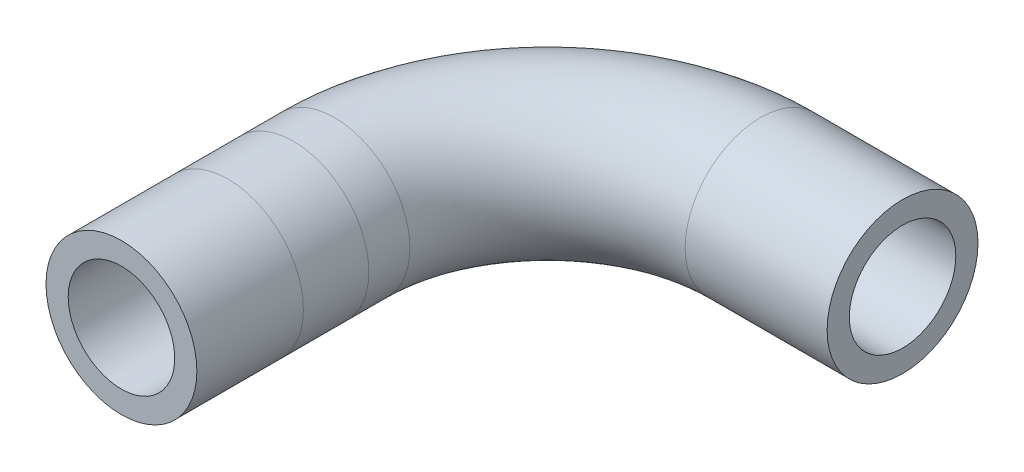
ISO-10303-21;
HEADER;
FILE_DESCRIPTION(('STEP AP214'),'2;1');
FILE_NAME('part.step','',(''),(''),'','','');
FILE_SCHEMA(('AUTOMOTIVE_DESIGN { 1 0 10303 214 1 1 1 1 }'));
ENDSEC;
DATA;
#1=APPLICATION_CONTEXT('core data for automotive mechanical design processes');
#2=APPLICATION_PROTOCOL_DEFINITION('international standard','automotive_design',2000,#1);
#3=PRODUCT_CONTEXT('',#1,'mechanical');
#4=PRODUCT('Part','Part','',(#3));
#5=PRODUCT_RELATED_PRODUCT_CATEGORY('part','',(#4));
#6=PRODUCT_DEFINITION_FORMATION('','',#4);
#7=PRODUCT_DEFINITION_CONTEXT('part definition',#1,'design');
#8=PRODUCT_DEFINITION('design','',#6,#7);
#9=PRODUCT_DEFINITION_SHAPE('','',#8);
#10=(LENGTH_UNIT() NAMED_UNIT(*) SI_UNIT(.MILLI.,.METRE.));
#11=(NAMED_UNIT(*) PLANE_ANGLE_UNIT() SI_UNIT($,.RADIAN.));
#12=(NAMED_UNIT(*) SI_UNIT($,.STERADIAN.) SOLID_ANGLE_UNIT());
#13=UNCERTAINTY_MEASURE_WITH_UNIT(LENGTH_MEASURE(1.E-05),#10,'distance_accuracy_value','');
#14=(GEOMETRIC_REPRESENTATION_CONTEXT(3) GLOBAL_UNCERTAINTY_ASSIGNED_CONTEXT((#13)) GLOBAL_UNIT_ASSIGNED_CONTEXT((#10,
#11,#12)) REPRESENTATION_CONTEXT('',''));
#15=CARTESIAN_POINT('',(0.,0.,0.));
#16=DIRECTION('',(0.,0.,1.));
#17=DIRECTION('',(1.,0.,0.));
#18=AXIS2_PLACEMENT_3D('',#15,#16,#17);
#19=CARTESIAN_POINT('',(-39.4506366392634,4.41546785233906E-13,30.7500469580002));
#20=DIRECTION('',(0.,0.,-1.));
#21=DIRECTION('',(-1.,0.,0.));
#22=AXIS2_PLACEMENT_3D('',#19,#20,#21);
#23=PLANE('',#22);
#24=CARTESIAN_POINT('',(-39.4506366392634,4.41546785233906E-13,30.7500469580002));
#25=DIRECTION('',(0.,0.,-1.));
#26=DIRECTION('',(-1.,0.,0.));
#27=AXIS2_PLACEMENT_3D('',#24,#25,#26);
#28=CIRCLE('',#27,9.525);
#29=CARTESIAN_POINT('',(-48.9756366392634,4.41546785233906E-13,30.7500469580002));
#30=VERTEX_POINT('',#29);
#31=EDGE_CURVE('E85',#30,#30,#28,.F.);
#32=ORIENTED_EDGE('',*,*,#31,.F.);
#33=EDGE_LOOP('',(#32));
#34=FACE_BOUND('',#33,.T.);
#35=CARTESIAN_POINT('',(-39.4506366392634,4.41546785233906E-13,30.7500469580002));
#36=DIRECTION('',(0.,0.,-1.));
#37=DIRECTION('',(-1.,0.,0.));
#38=AXIS2_PLACEMENT_3D('',#35,#36,#37);
#39=CIRCLE('',#38,13.49375);
#40=CARTESIAN_POINT('',(-52.9443866392634,4.41546785233906E-13,30.7500469580002));
#41=VERTEX_POINT('',#40);
#42=EDGE_CURVE('E82',#41,#41,#39,.T.);
#43=ORIENTED_EDGE('',*,*,#42,.F.);
#44=EDGE_LOOP('',(#43));
#45=FACE_BOUND('',#44,.T.);
#46=ADVANCED_FACE('F60',(#34,#45),#23,.F.);
#47=CARTESIAN_POINT('',(24.0493633607368,4.39991483798989E-13,-45.4499530419998));
#48=DIRECTION('',(1.,0.,0.));
#49=DIRECTION('',(0.,0.,-1.));
#50=AXIS2_PLACEMENT_3D('',#47,#48,#49);
#51=PLANE('',#50);
#52=CARTESIAN_POINT('',(24.0493633607368,4.41157959875177E-13,-45.4499530419998));
#53=DIRECTION('',(1.,0.,0.));
#54=DIRECTION('',(0.,0.,-1.));
#55=AXIS2_PLACEMENT_3D('',#52,#53,#54);
#56=CIRCLE('',#55,9.525);
#57=CARTESIAN_POINT('',(24.0493633607367,4.41157959875177E-13,-54.9749530419998));
#58=VERTEX_POINT('',#57);
#59=EDGE_CURVE('E86',#58,#58,#56,.F.);
#60=ORIENTED_EDGE('',*,*,#59,.T.);
#61=EDGE_LOOP('',(#60));
#62=FACE_BOUND('',#61,.T.);
#63=CARTESIAN_POINT('',(24.0493633607368,4.39991483798989E-13,-45.4499530419998));
#64=DIRECTION('',(1.,0.,0.));
#65=DIRECTION('',(0.,0.,-1.));
#66=AXIS2_PLACEMENT_3D('',#63,#64,#65);
#67=CIRCLE('',#66,13.49375);
#68=CARTESIAN_POINT('',(24.0493633607367,4.39991483798989E-13,-58.9437030419998));
#69=VERTEX_POINT('',#68);
#70=EDGE_CURVE('E11',#69,#69,#67,.T.);
#71=ORIENTED_EDGE('',*,*,#70,.T.);
#72=EDGE_LOOP('',(#71));
#73=FACE_BOUND('',#72,.T.);
#74=ADVANCED_FACE('F109',(#62,#73),#51,.T.);
#75=CARTESIAN_POINT('',(-39.4506366392634,4.41546785233906E-13,30.7500469580002));
#76=DIRECTION('',(0.,0.,-1.));
#77=DIRECTION('',(-1.,0.,0.));
#78=AXIS2_PLACEMENT_3D('',#75,#76,#77);
#79=CYLINDRICAL_SURFACE('',#78,13.49375);
#80=CARTESIAN_POINT('',(-39.4506366392634,4.32029398355307E-13,11.7000469580002));
#81=DIRECTION('',(0.,0.,-1.));
#82=DIRECTION('',(-1.,0.,0.));
#83=AXIS2_PLACEMENT_3D('',#80,#81,#82);
#84=CIRCLE('',#83,13.49375);
#85=CARTESIAN_POINT('',(-52.9443866392634,4.32029398355307E-13,11.7000469580002));
#86=VERTEX_POINT('',#85);
#87=EDGE_CURVE('E79',#86,#86,#84,.T.);
#88=ORIENTED_EDGE('',*,*,#87,.F.);
#89=EDGE_LOOP('',(#88));
#90=FACE_BOUND('',#89,.T.);
#91=ORIENTED_EDGE('',*,*,#42,.T.);
#92=EDGE_LOOP('',(#91));
#93=FACE_BOUND('',#92,.T.);
#94=ADVANCED_FACE('F113',(#90,#93),#79,.T.);
#95=CARTESIAN_POINT('',(-39.4506366392633,4.72405715726183E-13,11.7000469580003));
#96=DIRECTION('',(0.,0.,-1.));
#97=DIRECTION('',(-1.,0.,0.));
#98=AXIS2_PLACEMENT_3D('',#95,#96,#97);
#99=CYLINDRICAL_SURFACE('',#98,13.49375);
#100=CARTESIAN_POINT('',(-39.4506366392633,4.81923102604782E-13,-3.04270497686332E-12));
#101=DIRECTION('',(0.,0.,-1.));
#102=DIRECTION('',(-1.,0.,0.));
#103=AXIS2_PLACEMENT_3D('',#100,#101,#102);
#104=CIRCLE('',#103,13.49375);
#105=CARTESIAN_POINT('',(-52.9443866392633,4.81923102604782E-13,-3.02718376681511E-12));
#106=VERTEX_POINT('',#105);
#107=EDGE_CURVE('E74',#106,#106,#104,.T.);
#108=ORIENTED_EDGE('',*,*,#107,.F.);
#109=EDGE_LOOP('',(#108));
#110=FACE_BOUND('',#109,.T.);
#111=ORIENTED_EDGE('',*,*,#87,.T.);
#112=EDGE_LOOP('',(#111));
#113=FACE_BOUND('',#112,.T.);
#114=ADVANCED_FACE('F115',(#110,#113),#99,.T.);
#115=CARTESIAN_POINT('',(-39.4506366392634,4.56909519797391E-13,-3.08780778723872E-12));
#116=DIRECTION('',(0.,0.,-1.));
#117=DIRECTION('',(-1.,0.,0.));
#118=AXIS2_PLACEMENT_3D('',#115,#116,#117);
#119=CYLINDRICAL_SURFACE('',#118,13.49375);
#120=CARTESIAN_POINT('',(-39.4506366392634,4.56909519797391E-13,-7.34995304199977));
#121=DIRECTION('',(0.,0.,-1.));
#122=DIRECTION('',(-1.,0.,0.));
#123=AXIS2_PLACEMENT_3D('',#120,#121,#122);
#124=CIRCLE('',#123,13.49375);
#125=CARTESIAN_POINT('',(-52.9443866392634,4.56634101834958E-13,-7.34995304199975));
#126=VERTEX_POINT('',#125);
#127=EDGE_CURVE('E70',#126,#126,#124,.T.);
#128=ORIENTED_EDGE('',*,*,#127,.F.);
#129=EDGE_LOOP('',(#128));
#130=FACE_BOUND('',#129,.T.);
#131=ORIENTED_EDGE('',*,*,#107,.T.);
#132=EDGE_LOOP('',(#131));
#133=FACE_BOUND('',#132,.T.);
#134=ADVANCED_FACE('F122',(#130,#133),#119,.T.);
#135=CARTESIAN_POINT('',(-1.35063663926338,4.5768717051485E-13,-7.34995304199981));
#136=DIRECTION('',(0.,-1.,0.));
#137=DIRECTION('',(0.,0.,-1.));
#138=AXIS2_PLACEMENT_3D('',#135,#136,#137);
#139=TOROIDAL_SURFACE('',#138,38.1,13.49375);
#140=CARTESIAN_POINT('',(-1.35063663926338,4.42324435951365E-13,-45.4499530419998));
#141=DIRECTION('',(1.,0.,0.));
#142=DIRECTION('',(0.,0.,-1.));
#143=AXIS2_PLACEMENT_3D('',#140,#141,#142);
#144=CIRCLE('',#143,13.49375);
#145=CARTESIAN_POINT('',(-1.35063663926338,4.36883467460131E-13,-58.9437030419998));
#146=VERTEX_POINT('',#145);
#147=EDGE_CURVE('E66',#146,#146,#144,.T.);
#148=CARTESIAN_POINT('',(-1.35063663926338,4.5768717051485E-13,-7.34995304199981));
#149=DIRECTION('',(0.,-1.,0.));
#150=DIRECTION('',(0.,0.,-1.));
#151=AXIS2_PLACEMENT_3D('',#148,#149,#150);
#152=CIRCLE('',#151,51.59375);
#153=EDGE_CURVE('',#126,#146,#152,.T.);
#154=ORIENTED_EDGE('',*,*,#127,.T.);
#155=ORIENTED_EDGE('',*,*,#147,.F.);
#156=ORIENTED_EDGE('',*,*,#153,.T.);
#157=ORIENTED_EDGE('',*,*,#153,.F.);
#158=EDGE_LOOP('',(#154,#156,#155,#157));
#159=FACE_BOUND('',#158,.T.);
#160=ADVANCED_FACE('F130',(#159),#139,.T.);
#161=CARTESIAN_POINT('',(-1.35063663926325,4.39991483798989E-13,-45.4499530419998));
#162=DIRECTION('',(1.,0.,0.));
#163=DIRECTION('',(0.,0.,-1.));
#164=AXIS2_PLACEMENT_3D('',#161,#162,#163);
#165=CYLINDRICAL_SURFACE('',#164,13.49375);
#166=ORIENTED_EDGE('',*,*,#70,.F.);
#167=EDGE_LOOP('',(#166));
#168=FACE_BOUND('',#167,.T.);
#169=ORIENTED_EDGE('',*,*,#147,.T.);
#170=EDGE_LOOP('',(#169));
#171=FACE_BOUND('',#170,.T.);
#172=ADVANCED_FACE('F128',(#168,#171),#165,.T.);
#173=CARTESIAN_POINT('',(-1.35063663926331,4.41157959875177E-13,-45.4499530419998));
#174=DIRECTION('',(1.,0.,0.));
#175=DIRECTION('',(0.,0.,-1.));
#176=AXIS2_PLACEMENT_3D('',#173,#174,#175);
#177=CYLINDRICAL_SURFACE('',#176,9.525);
#178=CARTESIAN_POINT('',(-1.35063663926338,4.42324435951365E-13,-45.4499530419998));
#179=DIRECTION('',(1.,0.,0.));
#180=DIRECTION('',(0.,0.,-1.));
#181=AXIS2_PLACEMENT_3D('',#178,#179,#180);
#182=CIRCLE('',#181,9.525);
#183=CARTESIAN_POINT('',(-1.35063663926338,4.38483752310494E-13,-54.9749530419998));
#184=VERTEX_POINT('',#183);
#185=EDGE_CURVE('E90',#184,#184,#182,.T.);
#186=ORIENTED_EDGE('',*,*,#185,.F.);
#187=EDGE_LOOP('',(#186));
#188=FACE_BOUND('',#187,.T.);
#189=ORIENTED_EDGE('',*,*,#59,.F.);
#190=EDGE_LOOP('',(#189));
#191=FACE_BOUND('',#190,.T.);
#192=ADVANCED_FACE('F110',(#188,#191),#177,.F.);
#193=CARTESIAN_POINT('',(-39.4506366392634,4.43545186678232E-13,34.7500469580002));
#194=DIRECTION('',(0.,0.,-1.));
#195=DIRECTION('',(-1.,0.,0.));
#196=AXIS2_PLACEMENT_3D('',#193,#194,#195);
#197=CYLINDRICAL_SURFACE('',#196,9.525);
#198=ORIENTED_EDGE('',*,*,#31,.T.);
#199=EDGE_LOOP('',(#198));
#200=FACE_BOUND('',#199,.T.);
#201=CARTESIAN_POINT('',(-39.4506366392634,4.32029398355308E-13,11.7000469580002));
#202=DIRECTION('',(0.,0.,-1.));
#203=DIRECTION('',(-1.,0.,0.));
#204=AXIS2_PLACEMENT_3D('',#201,#202,#203);
#205=CIRCLE('',#204,9.525);
#206=CARTESIAN_POINT('',(-48.9756366392634,4.32029398355308E-13,11.7000469580002));
#207=VERTEX_POINT('',#206);
#208=EDGE_CURVE('E89',#207,#207,#205,.T.);
#209=ORIENTED_EDGE('',*,*,#208,.T.);
#210=EDGE_LOOP('',(#209));
#211=FACE_BOUND('',#210,.T.);
#212=ADVANCED_FACE('F104',(#200,#211),#197,.F.);
#213=CARTESIAN_POINT('',(-39.4506366392634,4.72405715726183E-13,11.7000469580002));
#214=DIRECTION('',(0.,0.,-1.));
#215=DIRECTION('',(-1.,0.,0.));
#216=AXIS2_PLACEMENT_3D('',#213,#214,#215);
#217=CYLINDRICAL_SURFACE('',#216,9.525);
#218=CARTESIAN_POINT('',(-39.4506366392634,4.81923102604782E-13,-3.0739299994309E-12));
#219=DIRECTION('',(0.,0.,-1.));
#220=DIRECTION('',(-1.,0.,0.));
#221=AXIS2_PLACEMENT_3D('',#218,#219,#220);
#222=CIRCLE('',#221,9.525);
#223=CARTESIAN_POINT('',(-48.9756366392633,4.81923102604782E-13,-3.06297385116157E-12));
#224=VERTEX_POINT('',#223);
#225=EDGE_CURVE('E93',#224,#224,#222,.T.);
#226=ORIENTED_EDGE('',*,*,#225,.T.);
#227=EDGE_LOOP('',(#226));
#228=FACE_BOUND('',#227,.T.);
#229=ORIENTED_EDGE('',*,*,#208,.F.);
#230=EDGE_LOOP('',(#229));
#231=FACE_BOUND('',#230,.T.);
#232=ADVANCED_FACE('F189',(#228,#231),#217,.F.);
#233=CARTESIAN_POINT('',(-39.4506366392634,4.56909519797391E-13,-3.1190328098063E-12));
#234=DIRECTION('',(0.,0.,-1.));
#235=DIRECTION('',(-1.,0.,0.));
#236=AXIS2_PLACEMENT_3D('',#233,#234,#235);
#237=CYLINDRICAL_SURFACE('',#236,9.525);
#238=CARTESIAN_POINT('',(-39.4506366392634,4.56909519797391E-13,-7.3499530419998));
#239=DIRECTION('',(0.,0.,-1.));
#240=DIRECTION('',(-1.,0.,0.));
#241=AXIS2_PLACEMENT_3D('',#238,#239,#240);
#242=CIRCLE('',#241,9.525);
#243=CARTESIAN_POINT('',(-48.9756366392634,4.56715107118027E-13,-7.3499530419998));
#244=VERTEX_POINT('',#243);
#245=EDGE_CURVE('E96',#244,#244,#242,.T.);
#246=ORIENTED_EDGE('',*,*,#245,.T.);
#247=EDGE_LOOP('',(#246));
#248=FACE_BOUND('',#247,.T.);
#249=ORIENTED_EDGE('',*,*,#225,.F.);
#250=EDGE_LOOP('',(#249));
#251=FACE_BOUND('',#250,.T.);
#252=ADVANCED_FACE('F198',(#248,#251),#237,.F.);
#253=CARTESIAN_POINT('',(-1.35063663926338,4.5768717051485E-13,-7.34995304199981));
#254=DIRECTION('',(0.,-1.,0.));
#255=DIRECTION('',(0.,0.,-1.));
#256=AXIS2_PLACEMENT_3D('',#253,#254,#255);
#257=TOROIDAL_SURFACE('',#256,38.1,9.525);
#258=CARTESIAN_POINT('',(-1.35063663926338,4.5768717051485E-13,-7.34995304199981));
#259=DIRECTION('',(0.,-1.,0.));
#260=DIRECTION('',(0.,0.,-1.));
#261=AXIS2_PLACEMENT_3D('',#258,#259,#260);
#262=CIRCLE('',#261,47.625);
#263=EDGE_CURVE('',#244,#184,#262,.T.);
#264=ORIENTED_EDGE('',*,*,#245,.F.);
#265=ORIENTED_EDGE('',*,*,#185,.T.);
#266=ORIENTED_EDGE('',*,*,#263,.T.);
#267=ORIENTED_EDGE('',*,*,#263,.F.);
#268=EDGE_LOOP('',(#264,#266,#265,#267));
#269=FACE_BOUND('',#268,.T.);
#270=ADVANCED_FACE('F138',(#269),#257,.F.);
#271=CLOSED_SHELL('',(#46,#74,#94,#114,#134,#160,#172,#192,#212,#232,#252,#270));
#272=MANIFOLD_SOLID_BREP('B2',#271);
#273=ADVANCED_BREP_SHAPE_REPRESENTATION('',(#18,#272),#14);
#274=SHAPE_DEFINITION_REPRESENTATION(#9,#273);
ENDSEC;
END-ISO-10303-21;
